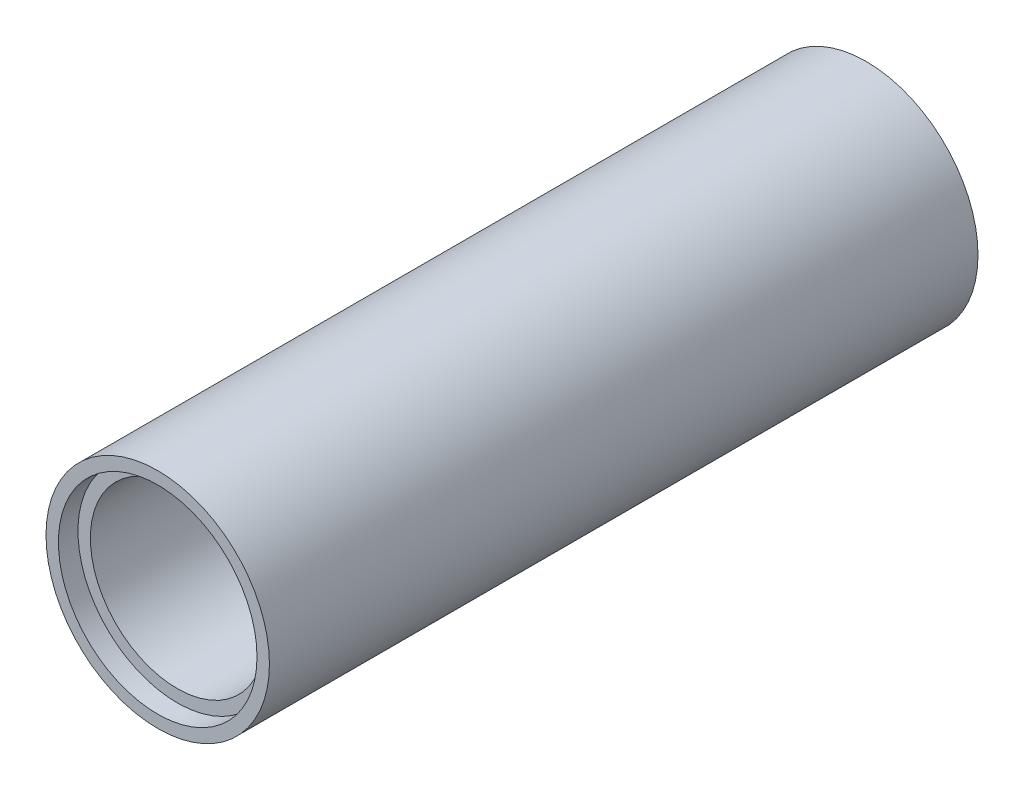
ISO-10303-21;
HEADER;
FILE_DESCRIPTION(('STEP AP214'),'2;1');
FILE_NAME('part.step','',(''),(''),'','','');
FILE_SCHEMA(('AUTOMOTIVE_DESIGN { 1 0 10303 214 1 1 1 1 }'));
ENDSEC;
DATA;
#1=APPLICATION_CONTEXT('core data for automotive mechanical design processes');
#2=APPLICATION_PROTOCOL_DEFINITION('international standard','automotive_design',2000,#1);
#3=PRODUCT_CONTEXT('',#1,'mechanical');
#4=PRODUCT('Part','Part','',(#3));
#5=PRODUCT_RELATED_PRODUCT_CATEGORY('part','',(#4));
#6=PRODUCT_DEFINITION_FORMATION('','',#4);
#7=PRODUCT_DEFINITION_CONTEXT('part definition',#1,'design');
#8=PRODUCT_DEFINITION('design','',#6,#7);
#9=PRODUCT_DEFINITION_SHAPE('','',#8);
#10=(LENGTH_UNIT() NAMED_UNIT(*) SI_UNIT(.MILLI.,.METRE.));
#11=(NAMED_UNIT(*) PLANE_ANGLE_UNIT() SI_UNIT($,.RADIAN.));
#12=(NAMED_UNIT(*) SI_UNIT($,.STERADIAN.) SOLID_ANGLE_UNIT());
#13=UNCERTAINTY_MEASURE_WITH_UNIT(LENGTH_MEASURE(1.E-05),#10,'distance_accuracy_value','');
#14=(GEOMETRIC_REPRESENTATION_CONTEXT(3) GLOBAL_UNCERTAINTY_ASSIGNED_CONTEXT((#13)) GLOBAL_UNIT_ASSIGNED_CONTEXT((#10,
#11,#12)) REPRESENTATION_CONTEXT('',''));
#15=CARTESIAN_POINT('',(0.,0.,0.));
#16=DIRECTION('',(0.,0.,1.));
#17=DIRECTION('',(1.,0.,0.));
#18=AXIS2_PLACEMENT_3D('',#15,#16,#17);
#19=CARTESIAN_POINT('',(0.,0.,362.5));
#20=DIRECTION('',(0.,0.,-1.));
#21=DIRECTION('',(-1.,0.,0.));
#22=AXIS2_PLACEMENT_3D('',#19,#20,#21);
#23=CYLINDRICAL_SURFACE('',#22,44.45);
#24=CARTESIAN_POINT('',(0.,0.,0.));
#25=DIRECTION('',(0.,0.,1.));
#26=DIRECTION('',(1.,0.,0.));
#27=AXIS2_PLACEMENT_3D('',#24,#25,#26);
#28=CIRCLE('',#27,44.45);
#29=CARTESIAN_POINT('',(44.45,0.,0.));
#30=VERTEX_POINT('',#29);
#31=EDGE_CURVE('E57',#30,#30,#28,.T.);
#32=ORIENTED_EDGE('',*,*,#31,.F.);
#33=EDGE_LOOP('',(#32));
#34=FACE_BOUND('',#33,.T.);
#35=CARTESIAN_POINT('',(0.,0.,352.5));
#36=DIRECTION('',(0.,0.,1.));
#37=DIRECTION('',(1.,0.,0.));
#38=AXIS2_PLACEMENT_3D('',#35,#36,#37);
#39=CIRCLE('',#38,44.45);
#40=CARTESIAN_POINT('',(44.45,0.,352.5));
#41=VERTEX_POINT('',#40);
#42=EDGE_CURVE('E67',#41,#41,#39,.T.);
#43=ORIENTED_EDGE('',*,*,#42,.T.);
#44=EDGE_LOOP('',(#43));
#45=FACE_BOUND('',#44,.T.);
#46=ADVANCED_FACE('F44',(#34,#45),#23,.F.);
#47=CARTESIAN_POINT('',(0.,0.,362.5));
#48=DIRECTION('',(0.,0.,1.));
#49=DIRECTION('',(1.,0.,0.));
#50=AXIS2_PLACEMENT_3D('',#47,#48,#49);
#51=PLANE('',#50);
#52=CARTESIAN_POINT('',(0.,0.,362.5));
#53=DIRECTION('',(0.,0.,1.));
#54=DIRECTION('',(1.,0.,0.));
#55=AXIS2_PLACEMENT_3D('',#52,#53,#54);
#56=CIRCLE('',#55,50.8);
#57=CARTESIAN_POINT('',(50.8,0.,362.5));
#58=VERTEX_POINT('',#57);
#59=EDGE_CURVE('E63',#58,#58,#56,.T.);
#60=ORIENTED_EDGE('',*,*,#59,.F.);
#61=EDGE_LOOP('',(#60));
#62=FACE_BOUND('',#61,.T.);
#63=CARTESIAN_POINT('',(0.,0.,362.5));
#64=DIRECTION('',(0.,0.,1.));
#65=DIRECTION('',(1.,0.,0.));
#66=AXIS2_PLACEMENT_3D('',#63,#64,#65);
#67=CIRCLE('',#66,57.15);
#68=CARTESIAN_POINT('',(57.15,0.,362.5));
#69=VERTEX_POINT('',#68);
#70=EDGE_CURVE('E11',#69,#69,#67,.T.);
#71=ORIENTED_EDGE('',*,*,#70,.T.);
#72=EDGE_LOOP('',(#71));
#73=FACE_BOUND('',#72,.T.);
#74=ADVANCED_FACE('F88',(#62,#73),#51,.T.);
#75=CARTESIAN_POINT('',(0.,0.,0.));
#76=DIRECTION('',(0.,0.,1.));
#77=DIRECTION('',(1.,0.,0.));
#78=AXIS2_PLACEMENT_3D('',#75,#76,#77);
#79=PLANE('',#78);
#80=CARTESIAN_POINT('',(0.,0.,0.));
#81=DIRECTION('',(0.,0.,1.));
#82=DIRECTION('',(1.,0.,0.));
#83=AXIS2_PLACEMENT_3D('',#80,#81,#82);
#84=CIRCLE('',#83,57.15);
#85=CARTESIAN_POINT('',(57.15,0.,0.));
#86=VERTEX_POINT('',#85);
#87=EDGE_CURVE('E48',#86,#86,#84,.T.);
#88=ORIENTED_EDGE('',*,*,#87,.F.);
#89=EDGE_LOOP('',(#88));
#90=FACE_BOUND('',#89,.T.);
#91=ORIENTED_EDGE('',*,*,#31,.T.);
#92=EDGE_LOOP('',(#91));
#93=FACE_BOUND('',#92,.T.);
#94=ADVANCED_FACE('F90',(#90,#93),#79,.F.);
#95=CARTESIAN_POINT('',(0.,0.,362.5));
#96=DIRECTION('',(0.,0.,-1.));
#97=DIRECTION('',(-1.,0.,0.));
#98=AXIS2_PLACEMENT_3D('',#95,#96,#97);
#99=CYLINDRICAL_SURFACE('',#98,57.15);
#100=ORIENTED_EDGE('',*,*,#70,.F.);
#101=EDGE_LOOP('',(#100));
#102=FACE_BOUND('',#101,.T.);
#103=ORIENTED_EDGE('',*,*,#87,.T.);
#104=EDGE_LOOP('',(#103));
#105=FACE_BOUND('',#104,.T.);
#106=ADVANCED_FACE('F46',(#102,#105),#99,.T.);
#107=CARTESIAN_POINT('',(0.,0.,352.5));
#108=DIRECTION('',(0.,0.,1.));
#109=DIRECTION('',(1.,0.,0.));
#110=AXIS2_PLACEMENT_3D('',#107,#108,#109);
#111=CYLINDRICAL_SURFACE('',#110,50.8);
#112=CARTESIAN_POINT('',(0.,0.,352.5));
#113=DIRECTION('',(0.,0.,1.));
#114=DIRECTION('',(1.,0.,0.));
#115=AXIS2_PLACEMENT_3D('',#112,#113,#114);
#116=CIRCLE('',#115,50.8);
#117=CARTESIAN_POINT('',(50.8,0.,352.5));
#118=VERTEX_POINT('',#117);
#119=EDGE_CURVE('E62',#118,#118,#116,.T.);
#120=ORIENTED_EDGE('',*,*,#119,.F.);
#121=EDGE_LOOP('',(#120));
#122=FACE_BOUND('',#121,.T.);
#123=ORIENTED_EDGE('',*,*,#59,.T.);
#124=EDGE_LOOP('',(#123));
#125=FACE_BOUND('',#124,.T.);
#126=ADVANCED_FACE('F79',(#122,#125),#111,.F.);
#127=CARTESIAN_POINT('',(0.,0.,352.5));
#128=DIRECTION('',(0.,0.,1.));
#129=DIRECTION('',(1.,0.,0.));
#130=AXIS2_PLACEMENT_3D('',#127,#128,#129);
#131=PLANE('',#130);
#132=ORIENTED_EDGE('',*,*,#42,.F.);
#133=EDGE_LOOP('',(#132));
#134=FACE_BOUND('',#133,.T.);
#135=ORIENTED_EDGE('',*,*,#119,.T.);
#136=EDGE_LOOP('',(#135));
#137=FACE_BOUND('',#136,.T.);
#138=ADVANCED_FACE('F76',(#134,#137),#131,.T.);
#139=CLOSED_SHELL('',(#46,#74,#94,#106,#126,#138));
#140=MANIFOLD_SOLID_BREP('B2',#139);
#141=ADVANCED_BREP_SHAPE_REPRESENTATION('',(#18,#140),#14);
#142=SHAPE_DEFINITION_REPRESENTATION(#9,#141);
ENDSEC;
END-ISO-10303-21;
